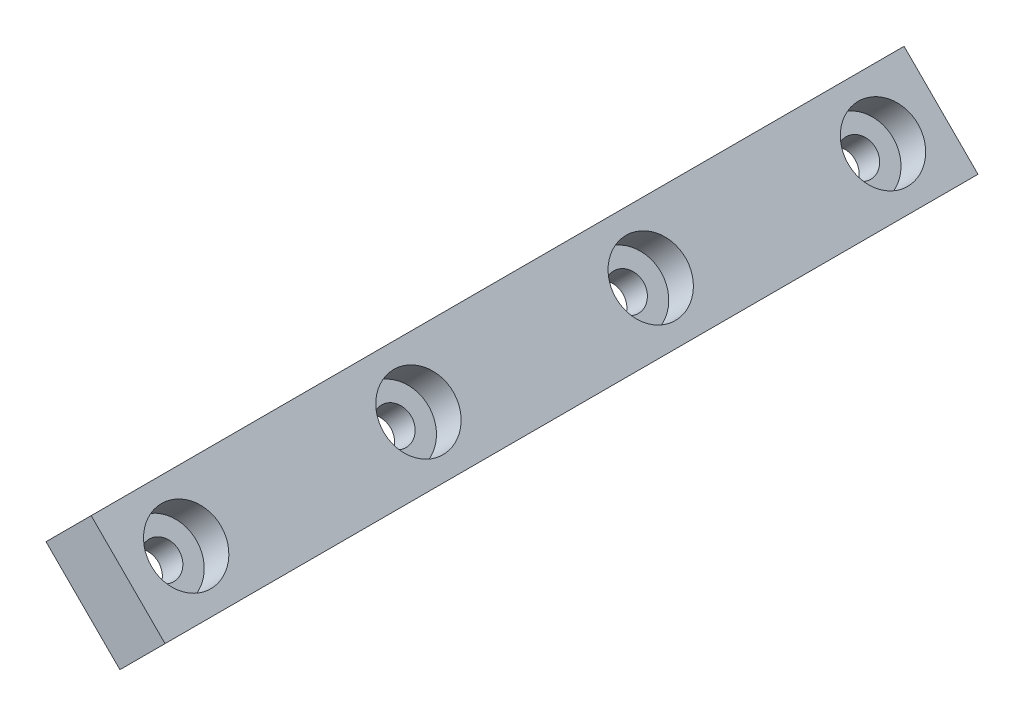
ISO-10303-21;
HEADER;
FILE_DESCRIPTION(('STEP AP214'),'2;1');
FILE_NAME('part.step','',(''),(''),'','','');
FILE_SCHEMA(('AUTOMOTIVE_DESIGN { 1 0 10303 214 1 1 1 1 }'));
ENDSEC;
DATA;
#1=APPLICATION_CONTEXT('core data for automotive mechanical design processes');
#2=APPLICATION_PROTOCOL_DEFINITION('international standard','automotive_design',2000,#1);
#3=PRODUCT_CONTEXT('',#1,'mechanical');
#4=PRODUCT('Part','Part','',(#3));
#5=PRODUCT_RELATED_PRODUCT_CATEGORY('part','',(#4));
#6=PRODUCT_DEFINITION_FORMATION('','',#4);
#7=PRODUCT_DEFINITION_CONTEXT('part definition',#1,'design');
#8=PRODUCT_DEFINITION('design','',#6,#7);
#9=PRODUCT_DEFINITION_SHAPE('','',#8);
#10=(LENGTH_UNIT() NAMED_UNIT(*) SI_UNIT(.MILLI.,.METRE.));
#11=(NAMED_UNIT(*) PLANE_ANGLE_UNIT() SI_UNIT($,.RADIAN.));
#12=(NAMED_UNIT(*) SI_UNIT($,.STERADIAN.) SOLID_ANGLE_UNIT());
#13=UNCERTAINTY_MEASURE_WITH_UNIT(LENGTH_MEASURE(1.E-05),#10,'distance_accuracy_value','');
#14=(GEOMETRIC_REPRESENTATION_CONTEXT(3) GLOBAL_UNCERTAINTY_ASSIGNED_CONTEXT((#13)) GLOBAL_UNIT_ASSIGNED_CONTEXT((#10,
#11,#12)) REPRESENTATION_CONTEXT('',''));
#15=CARTESIAN_POINT('',(0.,0.,0.));
#16=DIRECTION('',(0.,0.,1.));
#17=DIRECTION('',(1.,0.,0.));
#18=AXIS2_PLACEMENT_3D('',#15,#16,#17);
#19=CARTESIAN_POINT('',(35.3197740755949,-2.24659392859333,65.));
#20=DIRECTION('',(0.707106781185032,0.707106781188063,0.));
#21=DIRECTION('',(-0.707106781188063,0.707106781185032,0.));
#22=AXIS2_PLACEMENT_3D('',#19,#20,#21);
#23=CYLINDRICAL_SURFACE('',#22,1.5);
#24=CARTESIAN_POINT('',(84.4636953679614,46.8973273639839,65.));
#25=DIRECTION('',(0.707106781185787,0.707106781187309,0.));
#26=DIRECTION('',(-0.707106781187309,0.707106781185787,0.));
#27=AXIS2_PLACEMENT_3D('',#24,#25,#26);
#28=CIRCLE('',#27,1.5);
#29=CARTESIAN_POINT('',(83.4030351961805,47.9579875357626,65.));
#30=VERTEX_POINT('',#29);
#31=EDGE_CURVE('E141',#30,#30,#28,.T.);
#32=ORIENTED_EDGE('',*,*,#31,.F.);
#33=EDGE_LOOP('',(#32));
#34=FACE_BOUND('',#33,.T.);
#35=CARTESIAN_POINT('',(86.2314623209171,48.6650943169472,65.));
#36=DIRECTION('',(0.707106781185032,0.707106781188063,0.));
#37=DIRECTION('',(-0.707106781188063,0.707106781185032,0.));
#38=AXIS2_PLACEMENT_3D('',#35,#36,#37);
#39=CIRCLE('',#38,1.5);
#40=CARTESIAN_POINT('',(85.170802149135,49.7257544887248,65.));
#41=VERTEX_POINT('',#40);
#42=EDGE_CURVE('E38',#41,#41,#39,.F.);
#43=ORIENTED_EDGE('',*,*,#42,.F.);
#44=EDGE_LOOP('',(#43));
#45=FACE_BOUND('',#44,.T.);
#46=ADVANCED_FACE('F34',(#34,#45),#23,.F.);
#47=CARTESIAN_POINT('',(35.3197740755949,-2.24659392859333,45.));
#48=DIRECTION('',(0.707106781185032,0.707106781188063,0.));
#49=DIRECTION('',(-0.707106781188063,0.707106781185032,0.));
#50=AXIS2_PLACEMENT_3D('',#47,#48,#49);
#51=CYLINDRICAL_SURFACE('',#50,1.5);
#52=CARTESIAN_POINT('',(84.4636953679614,46.8973273639839,45.));
#53=DIRECTION('',(0.707106781185787,0.707106781187309,0.));
#54=DIRECTION('',(-0.707106781187309,0.707106781185787,0.));
#55=AXIS2_PLACEMENT_3D('',#52,#53,#54);
#56=CIRCLE('',#55,1.5);
#57=CARTESIAN_POINT('',(83.4030351961805,47.9579875357626,45.));
#58=VERTEX_POINT('',#57);
#59=EDGE_CURVE('E138',#58,#58,#56,.T.);
#60=ORIENTED_EDGE('',*,*,#59,.F.);
#61=EDGE_LOOP('',(#60));
#62=FACE_BOUND('',#61,.T.);
#63=CARTESIAN_POINT('',(86.2314623209171,48.6650943169472,45.));
#64=DIRECTION('',(0.707106781185032,0.707106781188063,0.));
#65=DIRECTION('',(-0.707106781188063,0.707106781185032,0.));
#66=AXIS2_PLACEMENT_3D('',#63,#64,#65);
#67=CIRCLE('',#66,1.5);
#68=CARTESIAN_POINT('',(85.170802149135,49.7257544887248,45.));
#69=VERTEX_POINT('',#68);
#70=EDGE_CURVE('E108',#69,#69,#67,.F.);
#71=ORIENTED_EDGE('',*,*,#70,.F.);
#72=EDGE_LOOP('',(#71));
#73=FACE_BOUND('',#72,.T.);
#74=ADVANCED_FACE('F195',(#62,#73),#51,.F.);
#75=CARTESIAN_POINT('',(35.3197740755949,-2.24659392859333,25.));
#76=DIRECTION('',(0.707106781185032,0.707106781188063,0.));
#77=DIRECTION('',(-0.707106781188063,0.707106781185032,0.));
#78=AXIS2_PLACEMENT_3D('',#75,#76,#77);
#79=CYLINDRICAL_SURFACE('',#78,1.5);
#80=CARTESIAN_POINT('',(84.4636953679614,46.8973273639839,25.));
#81=DIRECTION('',(0.707106781185787,0.707106781187309,0.));
#82=DIRECTION('',(-0.707106781187309,0.707106781185787,0.));
#83=AXIS2_PLACEMENT_3D('',#80,#81,#82);
#84=CIRCLE('',#83,1.5);
#85=CARTESIAN_POINT('',(83.4030351961805,47.9579875357626,25.));
#86=VERTEX_POINT('',#85);
#87=EDGE_CURVE('E135',#86,#86,#84,.T.);
#88=ORIENTED_EDGE('',*,*,#87,.F.);
#89=EDGE_LOOP('',(#88));
#90=FACE_BOUND('',#89,.T.);
#91=CARTESIAN_POINT('',(86.2314623209171,48.6650943169472,25.));
#92=DIRECTION('',(0.707106781185032,0.707106781188063,0.));
#93=DIRECTION('',(-0.707106781188063,0.707106781185032,0.));
#94=AXIS2_PLACEMENT_3D('',#91,#92,#93);
#95=CIRCLE('',#94,1.5);
#96=CARTESIAN_POINT('',(85.170802149135,49.7257544887248,25.));
#97=VERTEX_POINT('',#96);
#98=EDGE_CURVE('E104',#97,#97,#95,.F.);
#99=ORIENTED_EDGE('',*,*,#98,.F.);
#100=EDGE_LOOP('',(#99));
#101=FACE_BOUND('',#100,.T.);
#102=ADVANCED_FACE('F201',(#90,#101),#79,.F.);
#103=CARTESIAN_POINT('',(35.3197740755949,-2.24659392859333,4.99999999999999));
#104=DIRECTION('',(0.707106781185032,0.707106781188063,0.));
#105=DIRECTION('',(-0.707106781188063,0.707106781185032,0.));
#106=AXIS2_PLACEMENT_3D('',#103,#104,#105);
#107=CYLINDRICAL_SURFACE('',#106,1.5);
#108=CARTESIAN_POINT('',(84.4636953679614,46.8973273639839,4.99999999999999));
#109=DIRECTION('',(0.707106781185787,0.707106781187309,0.));
#110=DIRECTION('',(-0.707106781187309,0.707106781185787,0.));
#111=AXIS2_PLACEMENT_3D('',#108,#109,#110);
#112=CIRCLE('',#111,1.5);
#113=CARTESIAN_POINT('',(83.4030351961805,47.9579875357626,4.99999999999999));
#114=VERTEX_POINT('',#113);
#115=EDGE_CURVE('E102',#114,#114,#112,.T.);
#116=ORIENTED_EDGE('',*,*,#115,.F.);
#117=EDGE_LOOP('',(#116));
#118=FACE_BOUND('',#117,.T.);
#119=CARTESIAN_POINT('',(86.2314623209171,48.6650943169472,4.99999999999999));
#120=DIRECTION('',(0.707106781185032,0.707106781188063,0.));
#121=DIRECTION('',(-0.707106781188063,0.707106781185032,0.));
#122=AXIS2_PLACEMENT_3D('',#119,#120,#121);
#123=CIRCLE('',#122,1.5);
#124=CARTESIAN_POINT('',(85.170802149135,49.7257544887248,4.99999999999999));
#125=VERTEX_POINT('',#124);
#126=EDGE_CURVE('E99',#125,#125,#123,.F.);
#127=ORIENTED_EDGE('',*,*,#126,.F.);
#128=EDGE_LOOP('',(#127));
#129=FACE_BOUND('',#128,.T.);
#130=ADVANCED_FACE('F216',(#118,#129),#107,.F.);
#131=CARTESIAN_POINT('',(15.6012034866079,-15.601203486586,75.));
#132=DIRECTION('',(-0.707106781187044,0.707106781186051,0.));
#133=DIRECTION('',(-0.707106781186051,-0.707106781187044,0.));
#134=AXIS2_PLACEMENT_3D('',#131,#132,#133);
#135=PLANE('',#134);
#136=DIRECTION('',(-0.707106781186051,-0.707106781187044,0.));
#137=VECTOR('',#136,1.);
#138=CARTESIAN_POINT('',(15.6012034866079,-15.601203486586,70.));
#139=LINE('',#138,#137);
#140=CARTESIAN_POINT('',(85.1708021493451,53.9683951762489,70.));
#141=VERTEX_POINT('',#140);
#142=CARTESIAN_POINT('',(81.2817148528253,50.0793078797236,70.));
#143=VERTEX_POINT('',#142);
#144=EDGE_CURVE('E78',#141,#143,#139,.T.);
#145=ORIENTED_EDGE('',*,*,#144,.F.);
#146=DIRECTION('',(0.,0.,-1.));
#147=VECTOR('',#146,1.);
#148=CARTESIAN_POINT('',(85.1708021490331,53.9683951759369,75.));
#149=LINE('',#148,#147);
#150=CARTESIAN_POINT('',(85.1708021490331,53.9683951759369,0.));
#151=VERTEX_POINT('',#150);
#152=EDGE_CURVE('E59',#141,#151,#149,.T.);
#153=ORIENTED_EDGE('',*,*,#152,.T.);
#154=DIRECTION('',(0.707106781186051,0.707106781187044,0.));
#155=VECTOR('',#154,1.);
#156=CARTESIAN_POINT('',(15.6012034866079,-15.601203486586,0.));
#157=LINE('',#156,#155);
#158=CARTESIAN_POINT('',(81.2817148525201,50.0793078794184,0.));
#159=VERTEX_POINT('',#158);
#160=EDGE_CURVE('E144',#159,#151,#157,.T.);
#161=ORIENTED_EDGE('',*,*,#160,.F.);
#162=DIRECTION('',(0.,0.,-1.));
#163=VECTOR('',#162,1.);
#164=CARTESIAN_POINT('',(81.2817148525201,50.0793078794184,75.));
#165=LINE('',#164,#163);
#166=EDGE_CURVE('E11',#143,#159,#165,.T.);
#167=ORIENTED_EDGE('',*,*,#166,.F.);
#168=EDGE_LOOP('',(#145,#153,#161,#167));
#169=FACE_BOUND('',#168,.T.);
#170=ADVANCED_FACE('F36',(#169),#135,.T.);
#171=CARTESIAN_POINT('',(65.6805113658818,65.6805113660232,75.));
#172=DIRECTION('',(0.707106781185787,0.707106781187309,0.));
#173=DIRECTION('',(-0.707106781187309,0.707106781185787,0.));
#174=AXIS2_PLACEMENT_3D('',#171,#172,#173);
#175=PLANE('',#174);
#176=ORIENTED_EDGE('',*,*,#115,.T.);
#177=EDGE_LOOP('',(#176));
#178=FACE_BOUND('',#177,.T.);
#179=ORIENTED_EDGE('',*,*,#87,.T.);
#180=EDGE_LOOP('',(#179));
#181=FACE_BOUND('',#180,.T.);
#182=ORIENTED_EDGE('',*,*,#59,.T.);
#183=EDGE_LOOP('',(#182));
#184=FACE_BOUND('',#183,.T.);
#185=ORIENTED_EDGE('',*,*,#31,.T.);
#186=EDGE_LOOP('',(#185));
#187=FACE_BOUND('',#186,.T.);
#188=DIRECTION('',(0.,0.,-1.));
#189=VECTOR('',#188,1.);
#190=CARTESIAN_POINT('',(87.6456758832065,43.7153468487457,75.));
#191=LINE('',#190,#189);
#192=CARTESIAN_POINT('',(87.6456758832065,43.7153468487457,70.));
#193=VERTEX_POINT('',#192);
#194=CARTESIAN_POINT('',(87.6456758832065,43.7153468487457,0.));
#195=VERTEX_POINT('',#194);
#196=EDGE_CURVE('E43',#193,#195,#191,.T.);
#197=ORIENTED_EDGE('',*,*,#196,.F.);
#198=DIRECTION('',(0.707106781153398,-0.707106781219697,0.));
#199=VECTOR('',#198,1.);
#200=CARTESIAN_POINT('',(87.6456758832065,43.7153468487457,70.));
#201=LINE('',#200,#199);
#202=EDGE_CURVE('E76',#143,#193,#201,.T.);
#203=ORIENTED_EDGE('',*,*,#202,.F.);
#204=ORIENTED_EDGE('',*,*,#166,.T.);
#205=DIRECTION('',(0.707106781187309,-0.707106781185787,0.));
#206=VECTOR('',#205,1.);
#207=CARTESIAN_POINT('',(65.6805113658818,65.6805113660232,0.));
#208=LINE('',#207,#206);
#209=EDGE_CURVE('E93',#159,#195,#208,.T.);
#210=ORIENTED_EDGE('',*,*,#209,.T.);
#211=EDGE_LOOP('',(#197,#203,#204,#210));
#212=FACE_BOUND('',#211,.T.);
#213=ADVANCED_FACE('F91',(#178,#181,#184,#187,#212),#175,.F.);
#214=CARTESIAN_POINT('',(21.9651645131215,-21.965164515181,75.));
#215=DIRECTION('',(-0.707106781153398,0.707106781219697,0.));
#216=DIRECTION('',(-0.707106781219697,-0.707106781153398,0.));
#217=AXIS2_PLACEMENT_3D('',#214,#215,#216);
#218=PLANE('',#217);
#219=DIRECTION('',(0.,0.,-1.));
#220=VECTOR('',#219,1.);
#221=CARTESIAN_POINT('',(91.5347631799114,47.6044341450859,75.));
#222=LINE('',#221,#220);
#223=CARTESIAN_POINT('',(91.5347631799114,47.6044341450859,70.));
#224=VERTEX_POINT('',#223);
#225=CARTESIAN_POINT('',(91.5347631799114,47.6044341450859,0.));
#226=VERTEX_POINT('',#225);
#227=EDGE_CURVE('E88',#224,#226,#222,.T.);
#228=ORIENTED_EDGE('',*,*,#227,.F.);
#229=DIRECTION('',(0.707106781219698,0.707106781153397,0.));
#230=VECTOR('',#229,1.);
#231=CARTESIAN_POINT('',(87.6456758832065,43.7153468487457,70.));
#232=LINE('',#231,#230);
#233=EDGE_CURVE('E51',#193,#224,#232,.T.);
#234=ORIENTED_EDGE('',*,*,#233,.F.);
#235=ORIENTED_EDGE('',*,*,#196,.T.);
#236=DIRECTION('',(0.707106781219697,0.707106781153398,0.));
#237=VECTOR('',#236,1.);
#238=CARTESIAN_POINT('',(21.9651645131215,-21.965164515181,0.));
#239=LINE('',#238,#237);
#240=EDGE_CURVE('E147',#195,#226,#239,.T.);
#241=ORIENTED_EDGE('',*,*,#240,.T.);
#242=EDGE_LOOP('',(#228,#234,#235,#241));
#243=FACE_BOUND('',#242,.T.);
#244=ADVANCED_FACE('F85',(#243),#218,.F.);
#245=CARTESIAN_POINT('',(69.5695986623024,69.5695986626007,75.));
#246=DIRECTION('',(0.707106781185032,0.707106781188063,0.));
#247=DIRECTION('',(-0.707106781188063,0.707106781185032,0.));
#248=AXIS2_PLACEMENT_3D('',#245,#246,#247);
#249=PLANE('',#248);
#250=DIRECTION('',(-0.707106781153398,0.707106781219697,0.));
#251=VECTOR('',#250,1.);
#252=CARTESIAN_POINT('',(91.5347631799114,47.6044341450859,70.));
#253=LINE('',#252,#251);
#254=EDGE_CURVE('E89',#224,#141,#253,.T.);
#255=ORIENTED_EDGE('',*,*,#254,.F.);
#256=ORIENTED_EDGE('',*,*,#227,.T.);
#257=DIRECTION('',(0.707106781188063,-0.707106781185032,0.));
#258=VECTOR('',#257,1.);
#259=CARTESIAN_POINT('',(69.5695986623024,69.5695986626007,0.));
#260=LINE('',#259,#258);
#261=EDGE_CURVE('E149',#151,#226,#260,.T.);
#262=ORIENTED_EDGE('',*,*,#261,.F.);
#263=ORIENTED_EDGE('',*,*,#152,.F.);
#264=EDGE_LOOP('',(#255,#256,#262,#263));
#265=FACE_BOUND('',#264,.T.);
#266=CARTESIAN_POINT('',(88.3527826644722,50.7864146605114,65.));
#267=DIRECTION('',(0.707106781185032,0.707106781188063,0.));
#268=DIRECTION('',(-0.707106781188063,0.707106781185032,0.));
#269=AXIS2_PLACEMENT_3D('',#266,#267,#268);
#270=CIRCLE('',#269,3.);
#271=CARTESIAN_POINT('',(86.231462320908,52.9077350040665,65.));
#272=VERTEX_POINT('',#271);
#273=EDGE_CURVE('E124',#272,#272,#270,.T.);
#274=ORIENTED_EDGE('',*,*,#273,.F.);
#275=EDGE_LOOP('',(#274));
#276=FACE_BOUND('',#275,.T.);
#277=CARTESIAN_POINT('',(88.3527826644722,50.7864146605114,45.));
#278=DIRECTION('',(0.707106781185032,0.707106781188063,0.));
#279=DIRECTION('',(-0.707106781188063,0.707106781185032,0.));
#280=AXIS2_PLACEMENT_3D('',#277,#278,#279);
#281=CIRCLE('',#280,3.);
#282=CARTESIAN_POINT('',(86.231462320908,52.9077350040665,45.));
#283=VERTEX_POINT('',#282);
#284=EDGE_CURVE('E117',#283,#283,#281,.T.);
#285=ORIENTED_EDGE('',*,*,#284,.F.);
#286=EDGE_LOOP('',(#285));
#287=FACE_BOUND('',#286,.T.);
#288=CARTESIAN_POINT('',(88.3527826644722,50.7864146605114,25.));
#289=DIRECTION('',(0.707106781185032,0.707106781188063,0.));
#290=DIRECTION('',(-0.707106781188063,0.707106781185032,0.));
#291=AXIS2_PLACEMENT_3D('',#288,#289,#290);
#292=CIRCLE('',#291,3.);
#293=CARTESIAN_POINT('',(86.231462320908,52.9077350040665,25.));
#294=VERTEX_POINT('',#293);
#295=EDGE_CURVE('E110',#294,#294,#292,.T.);
#296=ORIENTED_EDGE('',*,*,#295,.F.);
#297=EDGE_LOOP('',(#296));
#298=FACE_BOUND('',#297,.T.);
#299=CARTESIAN_POINT('',(88.3527826644722,50.7864146605114,4.99999999999999));
#300=DIRECTION('',(0.707106781185032,0.707106781188063,0.));
#301=DIRECTION('',(-0.707106781188063,0.707106781185032,0.));
#302=AXIS2_PLACEMENT_3D('',#299,#300,#301);
#303=CIRCLE('',#302,3.);
#304=CARTESIAN_POINT('',(86.231462320908,52.9077350040665,4.99999999999999));
#305=VERTEX_POINT('',#304);
#306=EDGE_CURVE('E106',#305,#305,#303,.T.);
#307=ORIENTED_EDGE('',*,*,#306,.F.);
#308=EDGE_LOOP('',(#307));
#309=FACE_BOUND('',#308,.T.);
#310=ADVANCED_FACE('F155',(#265,#276,#287,#298,#309),#249,.T.);
#311=CARTESIAN_POINT('',(0.,0.,0.));
#312=DIRECTION('',(0.,0.,1.));
#313=DIRECTION('',(1.,0.,0.));
#314=AXIS2_PLACEMENT_3D('',#311,#312,#313);
#315=PLANE('',#314);
#316=ORIENTED_EDGE('',*,*,#160,.T.);
#317=ORIENTED_EDGE('',*,*,#261,.T.);
#318=ORIENTED_EDGE('',*,*,#240,.F.);
#319=ORIENTED_EDGE('',*,*,#209,.F.);
#320=EDGE_LOOP('',(#316,#317,#318,#319));
#321=FACE_BOUND('',#320,.T.);
#322=ADVANCED_FACE('F153',(#321),#315,.F.);
#323=CARTESIAN_POINT('',(86.2314623209171,48.6650943169472,4.99999999999999));
#324=DIRECTION('',(0.707106781185032,0.707106781188063,0.));
#325=DIRECTION('',(-0.707106781188063,0.707106781185032,0.));
#326=AXIS2_PLACEMENT_3D('',#323,#324,#325);
#327=PLANE('',#326);
#328=CARTESIAN_POINT('',(86.2314623209171,48.6650943169472,4.99999999999999));
#329=DIRECTION('',(0.707106781185032,0.707106781188063,0.));
#330=DIRECTION('',(-0.707106781188063,0.707106781185032,0.));
#331=AXIS2_PLACEMENT_3D('',#328,#329,#330);
#332=CIRCLE('',#331,3.);
#333=CARTESIAN_POINT('',(84.1101419773529,50.7864146605023,4.99999999999999));
#334=VERTEX_POINT('',#333);
#335=EDGE_CURVE('E103',#334,#334,#332,.T.);
#336=ORIENTED_EDGE('',*,*,#335,.T.);
#337=EDGE_LOOP('',(#336));
#338=FACE_BOUND('',#337,.T.);
#339=ORIENTED_EDGE('',*,*,#126,.T.);
#340=EDGE_LOOP('',(#339));
#341=FACE_BOUND('',#340,.T.);
#342=ADVANCED_FACE('F180',(#338,#341),#327,.T.);
#343=CARTESIAN_POINT('',(86.2314623209171,48.6650943169472,4.99999999999999));
#344=DIRECTION('',(0.707106781185032,0.707106781188063,0.));
#345=DIRECTION('',(-0.707106781188063,0.707106781185032,0.));
#346=AXIS2_PLACEMENT_3D('',#343,#344,#345);
#347=CYLINDRICAL_SURFACE('',#346,3.);
#348=CARTESIAN_POINT('',(84.1101419773529,50.7864146605023,4.99999999999999));
#349=CARTESIAN_POINT('',(84.132239064265,50.8085117474145,4.99999999999999));
#350=CARTESIAN_POINT('',(84.154336151177,50.8306088343266,4.99999999999999));
#351=CARTESIAN_POINT('',(84.1985303250011,50.8748030081508,4.99999999999999));
#352=CARTESIAN_POINT('',(84.2206274119131,50.896900095063,4.99999999999999));
#353=CARTESIAN_POINT('',(84.2648215857372,50.9410942688872,4.99999999999999));
#354=CARTESIAN_POINT('',(84.2869186726492,50.9631913557993,4.99999999999999));
#355=CARTESIAN_POINT('',(84.3311128464732,51.0073855296236,4.99999999999999));
#356=CARTESIAN_POINT('',(84.3532099333853,51.0294826165357,4.99999999999999));
#357=CARTESIAN_POINT('',(84.3974041072094,51.07367679036,4.99999999999999));
#358=CARTESIAN_POINT('',(84.4195011941214,51.0957738772721,4.99999999999999));
#359=CARTESIAN_POINT('',(84.4636953679454,51.1399680510964,4.99999999999999));
#360=CARTESIAN_POINT('',(84.4857924548575,51.1620651380085,4.99999999999999));
#361=CARTESIAN_POINT('',(84.5299866286815,51.2062593118327,4.99999999999999));
#362=CARTESIAN_POINT('',(84.5520837155936,51.2283563987449,4.99999999999999));
#363=CARTESIAN_POINT('',(84.5962778894176,51.2725505725691,4.99999999999999));
#364=CARTESIAN_POINT('',(84.6183749763297,51.2946476594813,4.99999999999999));
#365=CARTESIAN_POINT('',(84.6625691501537,51.3388418333055,4.99999999999999));
#366=CARTESIAN_POINT('',(84.6846662370658,51.3609389202176,4.99999999999999));
#367=CARTESIAN_POINT('',(84.7288604108898,51.4051330940419,4.99999999999999));
#368=CARTESIAN_POINT('',(84.7509574978019,51.427230180954,4.99999999999999));
#369=CARTESIAN_POINT('',(84.7951516716259,51.4714243547783,4.99999999999999));
#370=CARTESIAN_POINT('',(84.817248758538,51.4935214416904,4.99999999999999));
#371=CARTESIAN_POINT('',(84.861442932362,51.5377156155146,4.99999999999999));
#372=CARTESIAN_POINT('',(84.8835400192741,51.5598127024268,4.99999999999999));
#373=CARTESIAN_POINT('',(84.9277341930981,51.604006876251,4.99999999999999));
#374=CARTESIAN_POINT('',(84.9498312800102,51.6261039631632,4.99999999999999));
#375=CARTESIAN_POINT('',(84.9940254538342,51.6702981369874,4.99999999999999));
#376=CARTESIAN_POINT('',(85.0161225407463,51.6923952238995,4.99999999999999));
#377=CARTESIAN_POINT('',(85.0603167145703,51.7365893977238,4.99999999999999));
#378=CARTESIAN_POINT('',(85.0824138014823,51.7586864846359,4.99999999999999));
#379=CARTESIAN_POINT('',(85.1266079753064,51.8028806584602,4.99999999999999));
#380=CARTESIAN_POINT('',(85.1487050622184,51.8249777453723,4.99999999999999));
#381=CARTESIAN_POINT('',(85.1928992360425,51.8691719191966,4.99999999999999));
#382=CARTESIAN_POINT('',(85.2149963229545,51.8912690061087,4.99999999999999));
#383=CARTESIAN_POINT('',(85.2591904967786,51.9354631799329,4.99999999999999));
#384=CARTESIAN_POINT('',(85.2812875836906,51.9575602668451,4.99999999999999));
#385=CARTESIAN_POINT('',(85.3254817575147,52.0017544406693,4.99999999999999));
#386=CARTESIAN_POINT('',(85.3475788444267,52.0238515275814,4.99999999999999));
#387=CARTESIAN_POINT('',(85.3917730182508,52.0680457014057,4.99999999999999));
#388=CARTESIAN_POINT('',(85.4138701051628,52.0901427883178,4.99999999999999));
#389=CARTESIAN_POINT('',(85.4580642789869,52.1343369621421,4.99999999999999));
#390=CARTESIAN_POINT('',(85.4801613658989,52.1564340490542,4.99999999999999));
#391=CARTESIAN_POINT('',(85.524355539723,52.2006282228784,4.99999999999999));
#392=CARTESIAN_POINT('',(85.546452626635,52.2227253097906,4.99999999999999));
#393=CARTESIAN_POINT('',(85.5906468004591,52.2669194836148,4.99999999999999));
#394=CARTESIAN_POINT('',(85.6127438873711,52.289016570527,4.99999999999999));
#395=CARTESIAN_POINT('',(85.6569380611952,52.3332107443512,4.99999999999999));
#396=CARTESIAN_POINT('',(85.6790351481072,52.3553078312633,4.99999999999999));
#397=CARTESIAN_POINT('',(85.7232293219313,52.3995020050876,4.99999999999999));
#398=CARTESIAN_POINT('',(85.7453264088433,52.4215990919997,4.99999999999999));
#399=CARTESIAN_POINT('',(85.7895205826674,52.465793265824,4.99999999999999));
#400=CARTESIAN_POINT('',(85.8116176695794,52.4878903527361,4.99999999999999));
#401=CARTESIAN_POINT('',(85.8558118434035,52.5320845265604,4.99999999999999));
#402=CARTESIAN_POINT('',(85.8779089303155,52.5541816134725,4.99999999999999));
#403=CARTESIAN_POINT('',(85.9221031041396,52.5983757872967,4.99999999999999));
#404=CARTESIAN_POINT('',(85.9442001910516,52.6204728742089,4.99999999999999));
#405=CARTESIAN_POINT('',(85.9883943648757,52.6646670480331,4.99999999999999));
#406=CARTESIAN_POINT('',(86.0104914517877,52.6867641349452,4.99999999999999));
#407=CARTESIAN_POINT('',(86.0546856256118,52.7309583087695,4.99999999999999));
#408=CARTESIAN_POINT('',(86.0767827125238,52.7530553956816,4.99999999999999));
#409=CARTESIAN_POINT('',(86.1209768863479,52.7972495695059,4.99999999999999));
#410=CARTESIAN_POINT('',(86.1430739732599,52.819346656418,4.99999999999999));
#411=CARTESIAN_POINT('',(86.187268147084,52.8635408302423,4.99999999999999));
#412=CARTESIAN_POINT('',(86.209365233996,52.8856379171544,4.99999999999999));
#413=CARTESIAN_POINT('',(86.231462320908,52.9077350040665,4.99999999999999));
#414=B_SPLINE_CURVE_WITH_KNOTS('',3,(#348,#349,#350,#351,#352,#353,#354,#355,#356,#357,#358,
#359,#360,#361,#362,#363,#364,#365,#366,#367,#368,#369,#370,#371,#372,#373,#374,#375,#376,#377,
#378,#379,#380,#381,#382,#383,#384,#385,#386,#387,#388,#389,#390,#391,#392,#393,#394,#395,#396,
#397,#398,#399,#400,#401,#402,#403,#404,#405,#406,#407,#408,#409,#410,#411,#412,#413),
.UNSPECIFIED.,.F.,.F.,(4,2,2,2,2,2,2,2,2,2,2,2,2,2,2,2,2,2,2,2,2,2,2,2,2,2,2,2,2,2,2,2,4),(0.,
0.0937499999999984,0.187499999999997,0.281249999999995,0.374999999999994,0.468749999999992,
0.562499999999991,0.656249999999989,0.749999999999992,0.843750000000001,0.937499999999999,
1.03125,1.125,1.21874999999999,1.31249999999999,1.40624999999999,1.49999999999999,
1.59374999999999,1.68749999999999,1.78124999999999,1.87499999999999,1.96875,2.06249999999999,
2.15625,2.25,2.34374999999999,2.43749999999999,2.53124999999999,2.62499999999999,
2.71874999999999,2.81249999999999,2.90624999999999,3.),.UNSPECIFIED.);
#415=EDGE_CURVE('BSEAM177',#334,#305,#414,.T.);
#416=ORIENTED_EDGE('',*,*,#335,.F.);
#417=ORIENTED_EDGE('',*,*,#306,.T.);
#418=ORIENTED_EDGE('',*,*,#415,.T.);
#419=ORIENTED_EDGE('',*,*,#415,.F.);
#420=EDGE_LOOP('',(#416,#418,#417,#419));
#421=FACE_BOUND('',#420,.T.);
#422=ADVANCED_FACE('F177',(#421),#347,.F.);
#423=CARTESIAN_POINT('',(86.2314623209171,48.6650943169472,25.));
#424=DIRECTION('',(0.707106781185032,0.707106781188063,0.));
#425=DIRECTION('',(-0.707106781188063,0.707106781185032,0.));
#426=AXIS2_PLACEMENT_3D('',#423,#424,#425);
#427=PLANE('',#426);
#428=CARTESIAN_POINT('',(86.2314623209171,48.6650943169472,25.));
#429=DIRECTION('',(0.707106781185032,0.707106781188063,0.));
#430=DIRECTION('',(-0.707106781188063,0.707106781185032,0.));
#431=AXIS2_PLACEMENT_3D('',#428,#429,#430);
#432=CIRCLE('',#431,3.);
#433=CARTESIAN_POINT('',(84.1101419773529,50.7864146605023,25.));
#434=VERTEX_POINT('',#433);
#435=EDGE_CURVE('E107',#434,#434,#432,.T.);
#436=ORIENTED_EDGE('',*,*,#435,.T.);
#437=EDGE_LOOP('',(#436));
#438=FACE_BOUND('',#437,.T.);
#439=ORIENTED_EDGE('',*,*,#98,.T.);
#440=EDGE_LOOP('',(#439));
#441=FACE_BOUND('',#440,.T.);
#442=ADVANCED_FACE('F179',(#438,#441),#427,.T.);
#443=CARTESIAN_POINT('',(86.2314623209171,48.6650943169472,25.));
#444=DIRECTION('',(0.707106781185032,0.707106781188063,0.));
#445=DIRECTION('',(-0.707106781188063,0.707106781185032,0.));
#446=AXIS2_PLACEMENT_3D('',#443,#444,#445);
#447=CYLINDRICAL_SURFACE('',#446,3.);
#448=CARTESIAN_POINT('',(84.1101419773529,50.7864146605023,25.));
#449=CARTESIAN_POINT('',(84.132239064265,50.8085117474145,25.));
#450=CARTESIAN_POINT('',(84.154336151177,50.8306088343266,25.));
#451=CARTESIAN_POINT('',(84.1985303250011,50.8748030081508,25.));
#452=CARTESIAN_POINT('',(84.2206274119131,50.896900095063,25.));
#453=CARTESIAN_POINT('',(84.2648215857372,50.9410942688872,25.));
#454=CARTESIAN_POINT('',(84.2869186726492,50.9631913557993,25.));
#455=CARTESIAN_POINT('',(84.3311128464732,51.0073855296236,25.));
#456=CARTESIAN_POINT('',(84.3532099333853,51.0294826165357,25.));
#457=CARTESIAN_POINT('',(84.3974041072094,51.07367679036,25.));
#458=CARTESIAN_POINT('',(84.4195011941214,51.0957738772721,25.));
#459=CARTESIAN_POINT('',(84.4636953679454,51.1399680510964,25.));
#460=CARTESIAN_POINT('',(84.4857924548575,51.1620651380085,25.));
#461=CARTESIAN_POINT('',(84.5299866286815,51.2062593118327,25.));
#462=CARTESIAN_POINT('',(84.5520837155936,51.2283563987449,25.));
#463=CARTESIAN_POINT('',(84.5962778894176,51.2725505725691,25.));
#464=CARTESIAN_POINT('',(84.6183749763297,51.2946476594813,25.));
#465=CARTESIAN_POINT('',(84.6625691501537,51.3388418333055,25.));
#466=CARTESIAN_POINT('',(84.6846662370658,51.3609389202176,25.));
#467=CARTESIAN_POINT('',(84.7288604108898,51.4051330940419,25.));
#468=CARTESIAN_POINT('',(84.7509574978019,51.427230180954,25.));
#469=CARTESIAN_POINT('',(84.7951516716259,51.4714243547783,25.));
#470=CARTESIAN_POINT('',(84.817248758538,51.4935214416904,25.));
#471=CARTESIAN_POINT('',(84.861442932362,51.5377156155146,25.));
#472=CARTESIAN_POINT('',(84.8835400192741,51.5598127024268,25.));
#473=CARTESIAN_POINT('',(84.9277341930981,51.604006876251,25.));
#474=CARTESIAN_POINT('',(84.9498312800102,51.6261039631632,25.));
#475=CARTESIAN_POINT('',(84.9940254538342,51.6702981369874,25.));
#476=CARTESIAN_POINT('',(85.0161225407463,51.6923952238995,25.));
#477=CARTESIAN_POINT('',(85.0603167145703,51.7365893977238,25.));
#478=CARTESIAN_POINT('',(85.0824138014823,51.7586864846359,25.));
#479=CARTESIAN_POINT('',(85.1266079753064,51.8028806584602,25.));
#480=CARTESIAN_POINT('',(85.1487050622184,51.8249777453723,25.));
#481=CARTESIAN_POINT('',(85.1928992360425,51.8691719191966,25.));
#482=CARTESIAN_POINT('',(85.2149963229545,51.8912690061087,25.));
#483=CARTESIAN_POINT('',(85.2591904967786,51.9354631799329,25.));
#484=CARTESIAN_POINT('',(85.2812875836906,51.9575602668451,25.));
#485=CARTESIAN_POINT('',(85.3254817575147,52.0017544406693,25.));
#486=CARTESIAN_POINT('',(85.3475788444267,52.0238515275814,25.));
#487=CARTESIAN_POINT('',(85.3917730182508,52.0680457014057,25.));
#488=CARTESIAN_POINT('',(85.4138701051628,52.0901427883178,25.));
#489=CARTESIAN_POINT('',(85.4580642789869,52.1343369621421,25.));
#490=CARTESIAN_POINT('',(85.4801613658989,52.1564340490542,25.));
#491=CARTESIAN_POINT('',(85.524355539723,52.2006282228784,25.));
#492=CARTESIAN_POINT('',(85.546452626635,52.2227253097906,25.));
#493=CARTESIAN_POINT('',(85.5906468004591,52.2669194836148,25.));
#494=CARTESIAN_POINT('',(85.6127438873711,52.289016570527,25.));
#495=CARTESIAN_POINT('',(85.6569380611952,52.3332107443512,25.));
#496=CARTESIAN_POINT('',(85.6790351481072,52.3553078312633,25.));
#497=CARTESIAN_POINT('',(85.7232293219313,52.3995020050876,25.));
#498=CARTESIAN_POINT('',(85.7453264088433,52.4215990919997,25.));
#499=CARTESIAN_POINT('',(85.7895205826674,52.465793265824,25.));
#500=CARTESIAN_POINT('',(85.8116176695794,52.4878903527361,25.));
#501=CARTESIAN_POINT('',(85.8558118434035,52.5320845265604,25.));
#502=CARTESIAN_POINT('',(85.8779089303155,52.5541816134725,25.));
#503=CARTESIAN_POINT('',(85.9221031041396,52.5983757872967,25.));
#504=CARTESIAN_POINT('',(85.9442001910516,52.6204728742089,25.));
#505=CARTESIAN_POINT('',(85.9883943648757,52.6646670480331,25.));
#506=CARTESIAN_POINT('',(86.0104914517877,52.6867641349452,25.));
#507=CARTESIAN_POINT('',(86.0546856256118,52.7309583087695,25.));
#508=CARTESIAN_POINT('',(86.0767827125238,52.7530553956816,25.));
#509=CARTESIAN_POINT('',(86.1209768863479,52.7972495695059,25.));
#510=CARTESIAN_POINT('',(86.1430739732599,52.819346656418,25.));
#511=CARTESIAN_POINT('',(86.187268147084,52.8635408302423,25.));
#512=CARTESIAN_POINT('',(86.209365233996,52.8856379171544,25.));
#513=CARTESIAN_POINT('',(86.231462320908,52.9077350040665,25.));
#514=B_SPLINE_CURVE_WITH_KNOTS('',3,(#448,#449,#450,#451,#452,#453,#454,#455,#456,#457,#458,
#459,#460,#461,#462,#463,#464,#465,#466,#467,#468,#469,#470,#471,#472,#473,#474,#475,#476,#477,
#478,#479,#480,#481,#482,#483,#484,#485,#486,#487,#488,#489,#490,#491,#492,#493,#494,#495,#496,
#497,#498,#499,#500,#501,#502,#503,#504,#505,#506,#507,#508,#509,#510,#511,#512,#513),
.UNSPECIFIED.,.F.,.F.,(4,2,2,2,2,2,2,2,2,2,2,2,2,2,2,2,2,2,2,2,2,2,2,2,2,2,2,2,2,2,2,2,4),(0.,
0.0937499999999984,0.187499999999997,0.281249999999995,0.374999999999994,0.468749999999992,
0.562499999999991,0.656249999999989,0.749999999999992,0.843750000000001,0.937499999999999,
1.03125,1.125,1.21874999999999,1.31249999999999,1.40624999999999,1.49999999999999,
1.59374999999999,1.68749999999999,1.78124999999999,1.87499999999999,1.96875,2.06249999999999,
2.15625,2.25,2.34374999999999,2.43749999999999,2.53124999999999,2.62499999999999,
2.71874999999999,2.81249999999999,2.90624999999999,3.),.UNSPECIFIED.);
#515=EDGE_CURVE('BSEAM187',#434,#294,#514,.T.);
#516=ORIENTED_EDGE('',*,*,#435,.F.);
#517=ORIENTED_EDGE('',*,*,#295,.T.);
#518=ORIENTED_EDGE('',*,*,#515,.T.);
#519=ORIENTED_EDGE('',*,*,#515,.F.);
#520=EDGE_LOOP('',(#516,#518,#517,#519));
#521=FACE_BOUND('',#520,.T.);
#522=ADVANCED_FACE('F187',(#521),#447,.F.);
#523=CARTESIAN_POINT('',(86.2314623209171,48.6650943169472,45.));
#524=DIRECTION('',(0.707106781185032,0.707106781188063,0.));
#525=DIRECTION('',(-0.707106781188063,0.707106781185032,0.));
#526=AXIS2_PLACEMENT_3D('',#523,#524,#525);
#527=PLANE('',#526);
#528=CARTESIAN_POINT('',(86.2314623209171,48.6650943169472,45.));
#529=DIRECTION('',(0.707106781185032,0.707106781188063,0.));
#530=DIRECTION('',(-0.707106781188063,0.707106781185032,0.));
#531=AXIS2_PLACEMENT_3D('',#528,#529,#530);
#532=CIRCLE('',#531,3.);
#533=CARTESIAN_POINT('',(84.1101419773529,50.7864146605023,45.));
#534=VERTEX_POINT('',#533);
#535=EDGE_CURVE('E111',#534,#534,#532,.T.);
#536=ORIENTED_EDGE('',*,*,#535,.T.);
#537=EDGE_LOOP('',(#536));
#538=FACE_BOUND('',#537,.T.);
#539=ORIENTED_EDGE('',*,*,#70,.T.);
#540=EDGE_LOOP('',(#539));
#541=FACE_BOUND('',#540,.T.);
#542=ADVANCED_FACE('F291',(#538,#541),#527,.T.);
#543=CARTESIAN_POINT('',(86.2314623209171,48.6650943169472,45.));
#544=DIRECTION('',(0.707106781185032,0.707106781188063,0.));
#545=DIRECTION('',(-0.707106781188063,0.707106781185032,0.));
#546=AXIS2_PLACEMENT_3D('',#543,#544,#545);
#547=CYLINDRICAL_SURFACE('',#546,3.);
#548=CARTESIAN_POINT('',(84.1101419773529,50.7864146605023,45.));
#549=CARTESIAN_POINT('',(84.132239064265,50.8085117474145,45.));
#550=CARTESIAN_POINT('',(84.154336151177,50.8306088343266,45.));
#551=CARTESIAN_POINT('',(84.1985303250011,50.8748030081508,45.));
#552=CARTESIAN_POINT('',(84.2206274119131,50.896900095063,45.));
#553=CARTESIAN_POINT('',(84.2648215857372,50.9410942688872,45.));
#554=CARTESIAN_POINT('',(84.2869186726492,50.9631913557993,45.));
#555=CARTESIAN_POINT('',(84.3311128464732,51.0073855296236,45.));
#556=CARTESIAN_POINT('',(84.3532099333853,51.0294826165357,45.));
#557=CARTESIAN_POINT('',(84.3974041072094,51.07367679036,45.));
#558=CARTESIAN_POINT('',(84.4195011941214,51.0957738772721,45.));
#559=CARTESIAN_POINT('',(84.4636953679454,51.1399680510964,45.));
#560=CARTESIAN_POINT('',(84.4857924548575,51.1620651380085,45.));
#561=CARTESIAN_POINT('',(84.5299866286815,51.2062593118327,45.));
#562=CARTESIAN_POINT('',(84.5520837155936,51.2283563987449,45.));
#563=CARTESIAN_POINT('',(84.5962778894176,51.2725505725691,45.));
#564=CARTESIAN_POINT('',(84.6183749763297,51.2946476594813,45.));
#565=CARTESIAN_POINT('',(84.6625691501537,51.3388418333055,45.));
#566=CARTESIAN_POINT('',(84.6846662370658,51.3609389202176,45.));
#567=CARTESIAN_POINT('',(84.7288604108898,51.4051330940419,45.));
#568=CARTESIAN_POINT('',(84.7509574978019,51.427230180954,45.));
#569=CARTESIAN_POINT('',(84.7951516716259,51.4714243547783,45.));
#570=CARTESIAN_POINT('',(84.817248758538,51.4935214416904,45.));
#571=CARTESIAN_POINT('',(84.861442932362,51.5377156155146,45.));
#572=CARTESIAN_POINT('',(84.8835400192741,51.5598127024268,45.));
#573=CARTESIAN_POINT('',(84.9277341930981,51.604006876251,45.));
#574=CARTESIAN_POINT('',(84.9498312800102,51.6261039631632,45.));
#575=CARTESIAN_POINT('',(84.9940254538342,51.6702981369874,45.));
#576=CARTESIAN_POINT('',(85.0161225407463,51.6923952238995,45.));
#577=CARTESIAN_POINT('',(85.0603167145703,51.7365893977238,45.));
#578=CARTESIAN_POINT('',(85.0824138014823,51.7586864846359,45.));
#579=CARTESIAN_POINT('',(85.1266079753064,51.8028806584602,45.));
#580=CARTESIAN_POINT('',(85.1487050622184,51.8249777453723,45.));
#581=CARTESIAN_POINT('',(85.1928992360425,51.8691719191966,45.));
#582=CARTESIAN_POINT('',(85.2149963229545,51.8912690061087,45.));
#583=CARTESIAN_POINT('',(85.2591904967786,51.9354631799329,45.));
#584=CARTESIAN_POINT('',(85.2812875836906,51.9575602668451,45.));
#585=CARTESIAN_POINT('',(85.3254817575147,52.0017544406693,45.));
#586=CARTESIAN_POINT('',(85.3475788444267,52.0238515275814,45.));
#587=CARTESIAN_POINT('',(85.3917730182508,52.0680457014057,45.));
#588=CARTESIAN_POINT('',(85.4138701051628,52.0901427883178,45.));
#589=CARTESIAN_POINT('',(85.4580642789869,52.1343369621421,45.));
#590=CARTESIAN_POINT('',(85.4801613658989,52.1564340490542,45.));
#591=CARTESIAN_POINT('',(85.524355539723,52.2006282228784,45.));
#592=CARTESIAN_POINT('',(85.546452626635,52.2227253097906,45.));
#593=CARTESIAN_POINT('',(85.5906468004591,52.2669194836148,45.));
#594=CARTESIAN_POINT('',(85.6127438873711,52.289016570527,45.));
#595=CARTESIAN_POINT('',(85.6569380611952,52.3332107443512,45.));
#596=CARTESIAN_POINT('',(85.6790351481072,52.3553078312633,45.));
#597=CARTESIAN_POINT('',(85.7232293219313,52.3995020050876,45.));
#598=CARTESIAN_POINT('',(85.7453264088433,52.4215990919997,45.));
#599=CARTESIAN_POINT('',(85.7895205826674,52.465793265824,45.));
#600=CARTESIAN_POINT('',(85.8116176695794,52.4878903527361,45.));
#601=CARTESIAN_POINT('',(85.8558118434035,52.5320845265604,45.));
#602=CARTESIAN_POINT('',(85.8779089303155,52.5541816134725,45.));
#603=CARTESIAN_POINT('',(85.9221031041396,52.5983757872967,45.));
#604=CARTESIAN_POINT('',(85.9442001910516,52.6204728742089,45.));
#605=CARTESIAN_POINT('',(85.9883943648757,52.6646670480331,45.));
#606=CARTESIAN_POINT('',(86.0104914517877,52.6867641349452,45.));
#607=CARTESIAN_POINT('',(86.0546856256118,52.7309583087695,45.));
#608=CARTESIAN_POINT('',(86.0767827125238,52.7530553956816,45.));
#609=CARTESIAN_POINT('',(86.1209768863479,52.7972495695059,45.));
#610=CARTESIAN_POINT('',(86.1430739732599,52.819346656418,45.));
#611=CARTESIAN_POINT('',(86.187268147084,52.8635408302423,45.));
#612=CARTESIAN_POINT('',(86.209365233996,52.8856379171544,45.));
#613=CARTESIAN_POINT('',(86.231462320908,52.9077350040665,45.));
#614=B_SPLINE_CURVE_WITH_KNOTS('',3,(#548,#549,#550,#551,#552,#553,#554,#555,#556,#557,#558,
#559,#560,#561,#562,#563,#564,#565,#566,#567,#568,#569,#570,#571,#572,#573,#574,#575,#576,#577,
#578,#579,#580,#581,#582,#583,#584,#585,#586,#587,#588,#589,#590,#591,#592,#593,#594,#595,#596,
#597,#598,#599,#600,#601,#602,#603,#604,#605,#606,#607,#608,#609,#610,#611,#612,#613),
.UNSPECIFIED.,.F.,.F.,(4,2,2,2,2,2,2,2,2,2,2,2,2,2,2,2,2,2,2,2,2,2,2,2,2,2,2,2,2,2,2,2,4),(0.,
0.0937499999999984,0.187499999999997,0.281249999999995,0.374999999999994,0.468749999999992,
0.562499999999991,0.656249999999989,0.749999999999992,0.843750000000001,0.937499999999999,
1.03125,1.125,1.21874999999999,1.31249999999999,1.40624999999999,1.49999999999999,
1.59374999999999,1.68749999999999,1.78124999999999,1.87499999999999,1.96875,2.06249999999999,
2.15625,2.25,2.34374999999999,2.43749999999999,2.53124999999999,2.62499999999999,
2.71874999999999,2.81249999999999,2.90624999999999,3.),.UNSPECIFIED.);
#615=EDGE_CURVE('BSEAM284',#534,#283,#614,.T.);
#616=ORIENTED_EDGE('',*,*,#535,.F.);
#617=ORIENTED_EDGE('',*,*,#284,.T.);
#618=ORIENTED_EDGE('',*,*,#615,.T.);
#619=ORIENTED_EDGE('',*,*,#615,.F.);
#620=EDGE_LOOP('',(#616,#618,#617,#619));
#621=FACE_BOUND('',#620,.T.);
#622=ADVANCED_FACE('F284',(#621),#547,.F.);
#623=CARTESIAN_POINT('',(86.2314623209171,48.6650943169472,65.));
#624=DIRECTION('',(0.707106781185032,0.707106781188063,0.));
#625=DIRECTION('',(-0.707106781188063,0.707106781185032,0.));
#626=AXIS2_PLACEMENT_3D('',#623,#624,#625);
#627=PLANE('',#626);
#628=CARTESIAN_POINT('',(86.2314623209171,48.6650943169472,65.));
#629=DIRECTION('',(0.707106781185032,0.707106781188063,0.));
#630=DIRECTION('',(-0.707106781188063,0.707106781185032,0.));
#631=AXIS2_PLACEMENT_3D('',#628,#629,#630);
#632=CIRCLE('',#631,3.);
#633=CARTESIAN_POINT('',(84.1101419773529,50.7864146605023,65.));
#634=VERTEX_POINT('',#633);
#635=EDGE_CURVE('E159',#634,#634,#632,.T.);
#636=ORIENTED_EDGE('',*,*,#635,.T.);
#637=EDGE_LOOP('',(#636));
#638=FACE_BOUND('',#637,.T.);
#639=ORIENTED_EDGE('',*,*,#42,.T.);
#640=EDGE_LOOP('',(#639));
#641=FACE_BOUND('',#640,.T.);
#642=ADVANCED_FACE('F279',(#638,#641),#627,.T.);
#643=CARTESIAN_POINT('',(86.2314623209171,48.6650943169472,65.));
#644=DIRECTION('',(0.707106781185032,0.707106781188063,0.));
#645=DIRECTION('',(-0.707106781188063,0.707106781185032,0.));
#646=AXIS2_PLACEMENT_3D('',#643,#644,#645);
#647=CYLINDRICAL_SURFACE('',#646,3.);
#648=CARTESIAN_POINT('',(84.1101419773529,50.7864146605023,65.));
#649=CARTESIAN_POINT('',(84.132239064265,50.8085117474145,65.));
#650=CARTESIAN_POINT('',(84.154336151177,50.8306088343266,65.));
#651=CARTESIAN_POINT('',(84.1985303250011,50.8748030081508,65.));
#652=CARTESIAN_POINT('',(84.2206274119131,50.896900095063,65.));
#653=CARTESIAN_POINT('',(84.2648215857372,50.9410942688872,65.));
#654=CARTESIAN_POINT('',(84.2869186726492,50.9631913557993,65.));
#655=CARTESIAN_POINT('',(84.3311128464732,51.0073855296236,65.));
#656=CARTESIAN_POINT('',(84.3532099333853,51.0294826165357,65.));
#657=CARTESIAN_POINT('',(84.3974041072094,51.07367679036,65.));
#658=CARTESIAN_POINT('',(84.4195011941214,51.0957738772721,65.));
#659=CARTESIAN_POINT('',(84.4636953679454,51.1399680510964,65.));
#660=CARTESIAN_POINT('',(84.4857924548575,51.1620651380085,65.));
#661=CARTESIAN_POINT('',(84.5299866286815,51.2062593118327,65.));
#662=CARTESIAN_POINT('',(84.5520837155936,51.2283563987449,65.));
#663=CARTESIAN_POINT('',(84.5962778894176,51.2725505725691,65.));
#664=CARTESIAN_POINT('',(84.6183749763297,51.2946476594813,65.));
#665=CARTESIAN_POINT('',(84.6625691501537,51.3388418333055,65.));
#666=CARTESIAN_POINT('',(84.6846662370658,51.3609389202176,65.));
#667=CARTESIAN_POINT('',(84.7288604108898,51.4051330940419,65.));
#668=CARTESIAN_POINT('',(84.7509574978019,51.427230180954,65.));
#669=CARTESIAN_POINT('',(84.7951516716259,51.4714243547783,65.));
#670=CARTESIAN_POINT('',(84.817248758538,51.4935214416904,65.));
#671=CARTESIAN_POINT('',(84.861442932362,51.5377156155146,65.));
#672=CARTESIAN_POINT('',(84.8835400192741,51.5598127024268,65.));
#673=CARTESIAN_POINT('',(84.9277341930981,51.604006876251,65.));
#674=CARTESIAN_POINT('',(84.9498312800102,51.6261039631632,65.));
#675=CARTESIAN_POINT('',(84.9940254538342,51.6702981369874,65.));
#676=CARTESIAN_POINT('',(85.0161225407463,51.6923952238995,65.));
#677=CARTESIAN_POINT('',(85.0603167145703,51.7365893977238,65.));
#678=CARTESIAN_POINT('',(85.0824138014823,51.7586864846359,65.));
#679=CARTESIAN_POINT('',(85.1266079753064,51.8028806584602,65.));
#680=CARTESIAN_POINT('',(85.1487050622184,51.8249777453723,65.));
#681=CARTESIAN_POINT('',(85.1928992360425,51.8691719191966,65.));
#682=CARTESIAN_POINT('',(85.2149963229545,51.8912690061087,65.));
#683=CARTESIAN_POINT('',(85.2591904967786,51.9354631799329,65.));
#684=CARTESIAN_POINT('',(85.2812875836906,51.9575602668451,65.));
#685=CARTESIAN_POINT('',(85.3254817575147,52.0017544406693,65.));
#686=CARTESIAN_POINT('',(85.3475788444267,52.0238515275814,65.));
#687=CARTESIAN_POINT('',(85.3917730182508,52.0680457014057,65.));
#688=CARTESIAN_POINT('',(85.4138701051628,52.0901427883178,65.));
#689=CARTESIAN_POINT('',(85.4580642789869,52.1343369621421,65.));
#690=CARTESIAN_POINT('',(85.4801613658989,52.1564340490542,65.));
#691=CARTESIAN_POINT('',(85.524355539723,52.2006282228784,65.));
#692=CARTESIAN_POINT('',(85.546452626635,52.2227253097906,65.));
#693=CARTESIAN_POINT('',(85.5906468004591,52.2669194836148,65.));
#694=CARTESIAN_POINT('',(85.6127438873711,52.289016570527,65.));
#695=CARTESIAN_POINT('',(85.6569380611952,52.3332107443512,65.));
#696=CARTESIAN_POINT('',(85.6790351481072,52.3553078312633,65.));
#697=CARTESIAN_POINT('',(85.7232293219313,52.3995020050876,65.));
#698=CARTESIAN_POINT('',(85.7453264088433,52.4215990919997,65.));
#699=CARTESIAN_POINT('',(85.7895205826674,52.465793265824,65.));
#700=CARTESIAN_POINT('',(85.8116176695794,52.4878903527361,65.));
#701=CARTESIAN_POINT('',(85.8558118434035,52.5320845265604,65.));
#702=CARTESIAN_POINT('',(85.8779089303155,52.5541816134725,65.));
#703=CARTESIAN_POINT('',(85.9221031041396,52.5983757872967,65.));
#704=CARTESIAN_POINT('',(85.9442001910516,52.6204728742089,65.));
#705=CARTESIAN_POINT('',(85.9883943648757,52.6646670480331,65.));
#706=CARTESIAN_POINT('',(86.0104914517877,52.6867641349452,65.));
#707=CARTESIAN_POINT('',(86.0546856256118,52.7309583087695,65.));
#708=CARTESIAN_POINT('',(86.0767827125238,52.7530553956816,65.));
#709=CARTESIAN_POINT('',(86.1209768863479,52.7972495695059,65.));
#710=CARTESIAN_POINT('',(86.1430739732599,52.819346656418,65.));
#711=CARTESIAN_POINT('',(86.187268147084,52.8635408302423,65.));
#712=CARTESIAN_POINT('',(86.209365233996,52.8856379171544,65.));
#713=CARTESIAN_POINT('',(86.231462320908,52.9077350040665,65.));
#714=B_SPLINE_CURVE_WITH_KNOTS('',3,(#648,#649,#650,#651,#652,#653,#654,#655,#656,#657,#658,
#659,#660,#661,#662,#663,#664,#665,#666,#667,#668,#669,#670,#671,#672,#673,#674,#675,#676,#677,
#678,#679,#680,#681,#682,#683,#684,#685,#686,#687,#688,#689,#690,#691,#692,#693,#694,#695,#696,
#697,#698,#699,#700,#701,#702,#703,#704,#705,#706,#707,#708,#709,#710,#711,#712,#713),
.UNSPECIFIED.,.F.,.F.,(4,2,2,2,2,2,2,2,2,2,2,2,2,2,2,2,2,2,2,2,2,2,2,2,2,2,2,2,2,2,2,2,4),(0.,
0.0937499999999984,0.187499999999997,0.281249999999995,0.374999999999994,0.468749999999992,
0.562499999999991,0.656249999999989,0.749999999999992,0.843750000000001,0.937499999999999,
1.03125,1.125,1.21874999999999,1.31249999999999,1.40624999999999,1.49999999999999,
1.59374999999999,1.68749999999999,1.78124999999999,1.87499999999999,1.96875,2.06249999999999,
2.15625,2.25,2.34374999999999,2.43749999999999,2.53124999999999,2.62499999999999,
2.71874999999999,2.81249999999999,2.90624999999999,3.),.UNSPECIFIED.);
#715=EDGE_CURVE('BSEAM167',#634,#272,#714,.T.);
#716=ORIENTED_EDGE('',*,*,#635,.F.);
#717=ORIENTED_EDGE('',*,*,#273,.T.);
#718=ORIENTED_EDGE('',*,*,#715,.T.);
#719=ORIENTED_EDGE('',*,*,#715,.F.);
#720=EDGE_LOOP('',(#716,#718,#717,#719));
#721=FACE_BOUND('',#720,.T.);
#722=ADVANCED_FACE('F167',(#721),#647,.F.);
#723=CARTESIAN_POINT('',(0.,0.,70.));
#724=DIRECTION('',(0.,0.,-1.));
#725=DIRECTION('',(-1.,0.,0.));
#726=AXIS2_PLACEMENT_3D('',#723,#724,#725);
#727=PLANE('',#726);
#728=ORIENTED_EDGE('',*,*,#144,.T.);
#729=ORIENTED_EDGE('',*,*,#202,.T.);
#730=ORIENTED_EDGE('',*,*,#233,.T.);
#731=ORIENTED_EDGE('',*,*,#254,.T.);
#732=EDGE_LOOP('',(#728,#729,#730,#731));
#733=FACE_BOUND('',#732,.T.);
#734=ADVANCED_FACE('F77',(#733),#727,.F.);
#735=CLOSED_SHELL('',(#46,#74,#102,#130,#170,#213,#244,#310,#322,#342,#422,#442,#522,#542,#622,
#642,#722,#734));
#736=MANIFOLD_SOLID_BREP('B2',#735);
#737=ADVANCED_BREP_SHAPE_REPRESENTATION('',(#18,#736),#14);
#738=SHAPE_DEFINITION_REPRESENTATION(#9,#737);
ENDSEC;
END-ISO-10303-21;
